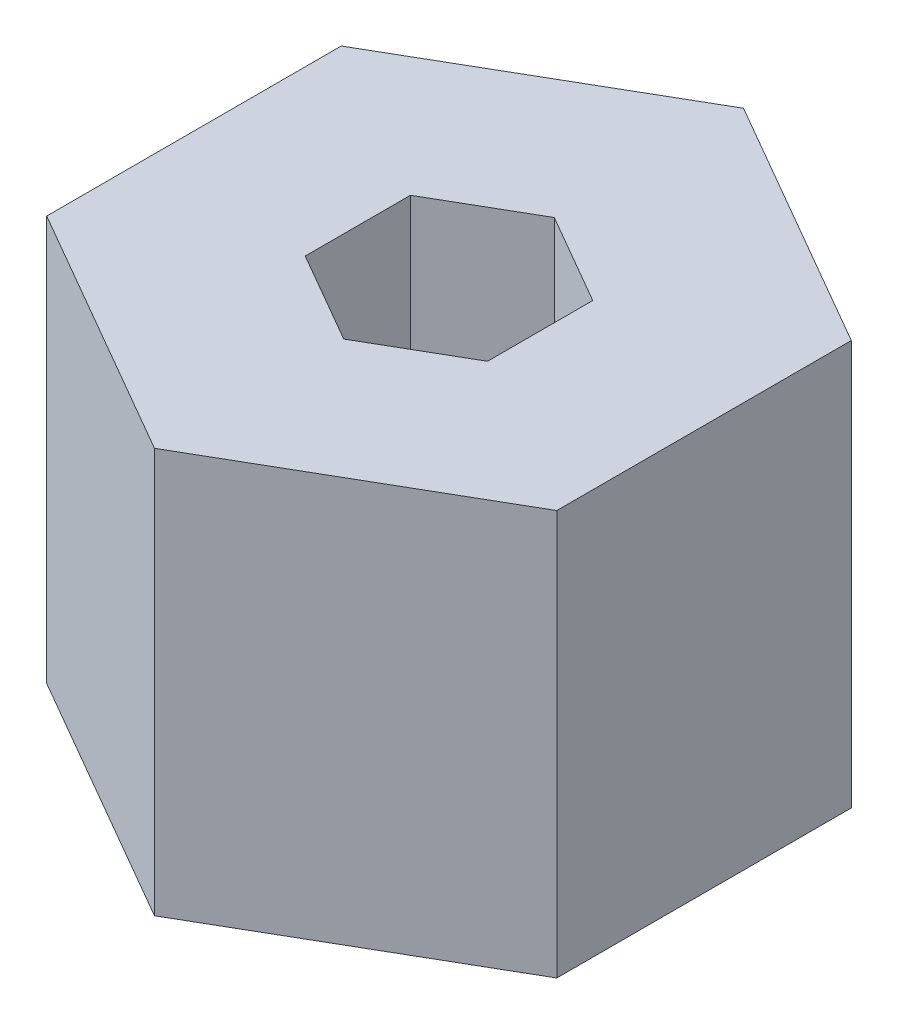
ISO-10303-21;
HEADER;
FILE_DESCRIPTION(('STEP AP214'),'2;1');
FILE_NAME('part.step','',(''),(''),'','','');
FILE_SCHEMA(('AUTOMOTIVE_DESIGN { 1 0 10303 214 1 1 1 1 }'));
ENDSEC;
DATA;
#1=APPLICATION_CONTEXT('core data for automotive mechanical design processes');
#2=APPLICATION_PROTOCOL_DEFINITION('international standard','automotive_design',2000,#1);
#3=PRODUCT_CONTEXT('',#1,'mechanical');
#4=PRODUCT('Part','Part','',(#3));
#5=PRODUCT_RELATED_PRODUCT_CATEGORY('part','',(#4));
#6=PRODUCT_DEFINITION_FORMATION('','',#4);
#7=PRODUCT_DEFINITION_CONTEXT('part definition',#1,'design');
#8=PRODUCT_DEFINITION('design','',#6,#7);
#9=PRODUCT_DEFINITION_SHAPE('','',#8);
#10=(LENGTH_UNIT() NAMED_UNIT(*) SI_UNIT(.MILLI.,.METRE.));
#11=(NAMED_UNIT(*) PLANE_ANGLE_UNIT() SI_UNIT($,.RADIAN.));
#12=(NAMED_UNIT(*) SI_UNIT($,.STERADIAN.) SOLID_ANGLE_UNIT());
#13=UNCERTAINTY_MEASURE_WITH_UNIT(LENGTH_MEASURE(1.E-05),#10,'distance_accuracy_value','');
#14=(GEOMETRIC_REPRESENTATION_CONTEXT(3) GLOBAL_UNCERTAINTY_ASSIGNED_CONTEXT((#13)) GLOBAL_UNIT_ASSIGNED_CONTEXT((#10,
#11,#12)) REPRESENTATION_CONTEXT('',''));
#15=CARTESIAN_POINT('',(0.,0.,0.));
#16=DIRECTION('',(0.,0.,1.));
#17=DIRECTION('',(1.,0.,0.));
#18=AXIS2_PLACEMENT_3D('',#15,#16,#17);
#19=CARTESIAN_POINT('',(0.,10.,0.));
#20=DIRECTION('',(0.,1.,0.));
#21=DIRECTION('',(0.,0.,1.));
#22=AXIS2_PLACEMENT_3D('',#19,#20,#21);
#23=PLANE('',#22);
#24=DIRECTION('',(-0.866025403784439,0.,-0.5));
#25=VECTOR('',#24,1.);
#26=CARTESIAN_POINT('',(6.3,10.,-3.63730669589464));
#27=LINE('',#26,#25);
#28=CARTESIAN_POINT('',(6.3,10.,-3.63730669589464));
#29=VERTEX_POINT('',#28);
#30=CARTESIAN_POINT('',(0.,10.,-7.27461339178929));
#31=VERTEX_POINT('',#30);
#32=EDGE_CURVE('E173',#29,#31,#27,.T.);
#33=ORIENTED_EDGE('',*,*,#32,.T.);
#34=DIRECTION('',(-0.866025403784438,0.,0.5));
#35=VECTOR('',#34,1.);
#36=CARTESIAN_POINT('',(0.,10.,-7.27461339178929));
#37=LINE('',#36,#35);
#38=CARTESIAN_POINT('',(-6.3,10.,-3.63730669589464));
#39=VERTEX_POINT('',#38);
#40=EDGE_CURVE('E176',#31,#39,#37,.T.);
#41=ORIENTED_EDGE('',*,*,#40,.T.);
#42=DIRECTION('',(0.,0.,1.));
#43=VECTOR('',#42,1.);
#44=CARTESIAN_POINT('',(-6.3,10.,-3.63730669589464));
#45=LINE('',#44,#43);
#46=CARTESIAN_POINT('',(-6.3,10.,3.63730669589464));
#47=VERTEX_POINT('',#46);
#48=EDGE_CURVE('E179',#39,#47,#45,.T.);
#49=ORIENTED_EDGE('',*,*,#48,.T.);
#50=DIRECTION('',(0.866025403784439,0.,0.5));
#51=VECTOR('',#50,1.);
#52=CARTESIAN_POINT('',(-6.3,10.,3.63730669589464));
#53=LINE('',#52,#51);
#54=CARTESIAN_POINT('',(0.,10.,7.27461339178929));
#55=VERTEX_POINT('',#54);
#56=EDGE_CURVE('E181',#47,#55,#53,.T.);
#57=ORIENTED_EDGE('',*,*,#56,.T.);
#58=DIRECTION('',(0.866025403784439,0.,-0.5));
#59=VECTOR('',#58,1.);
#60=CARTESIAN_POINT('',(0.,10.,7.27461339178929));
#61=LINE('',#60,#59);
#62=CARTESIAN_POINT('',(6.3,10.,3.63730669589464));
#63=VERTEX_POINT('',#62);
#64=EDGE_CURVE('E183',#55,#63,#61,.T.);
#65=ORIENTED_EDGE('',*,*,#64,.T.);
#66=DIRECTION('',(0.,0.,-1.));
#67=VECTOR('',#66,1.);
#68=CARTESIAN_POINT('',(6.3,10.,3.63730669589464));
#69=LINE('',#68,#67);
#70=EDGE_CURVE('E185',#63,#29,#69,.T.);
#71=ORIENTED_EDGE('',*,*,#70,.T.);
#72=EDGE_LOOP('',(#33,#41,#49,#57,#65,#71));
#73=FACE_BOUND('',#72,.T.);
#74=DIRECTION('',(-0.866025403784439,0.,0.5));
#75=VECTOR('',#74,1.);
#76=CARTESIAN_POINT('',(0.,10.,-2.6));
#77=LINE('',#76,#75);
#78=CARTESIAN_POINT('',(0.,10.,-2.6));
#79=VERTEX_POINT('',#78);
#80=CARTESIAN_POINT('',(-2.25166604983954,10.,-1.3));
#81=VERTEX_POINT('',#80);
#82=EDGE_CURVE('E130',#79,#81,#77,.T.);
#83=ORIENTED_EDGE('',*,*,#82,.F.);
#84=DIRECTION('',(-0.866025403784439,0.,-0.5));
#85=VECTOR('',#84,1.);
#86=CARTESIAN_POINT('',(2.25166604983954,10.,-1.3));
#87=LINE('',#86,#85);
#88=CARTESIAN_POINT('',(2.25166604983954,10.,-1.3));
#89=VERTEX_POINT('',#88);
#90=EDGE_CURVE('E122',#89,#79,#87,.T.);
#91=ORIENTED_EDGE('',*,*,#90,.F.);
#92=DIRECTION('',(0.,0.,-1.));
#93=VECTOR('',#92,1.);
#94=CARTESIAN_POINT('',(2.25166604983954,10.,1.3));
#95=LINE('',#94,#93);
#96=CARTESIAN_POINT('',(2.25166604983954,10.,1.3));
#97=VERTEX_POINT('',#96);
#98=EDGE_CURVE('E151',#97,#89,#95,.T.);
#99=ORIENTED_EDGE('',*,*,#98,.F.);
#100=DIRECTION('',(0.866025403784439,0.,-0.5));
#101=VECTOR('',#100,1.);
#102=CARTESIAN_POINT('',(0.,10.,2.6));
#103=LINE('',#102,#101);
#104=CARTESIAN_POINT('',(0.,10.,2.6));
#105=VERTEX_POINT('',#104);
#106=EDGE_CURVE('E149',#105,#97,#103,.T.);
#107=ORIENTED_EDGE('',*,*,#106,.F.);
#108=DIRECTION('',(0.866025403784439,0.,0.5));
#109=VECTOR('',#108,1.);
#110=CARTESIAN_POINT('',(-2.25166604983954,10.,1.3));
#111=LINE('',#110,#109);
#112=CARTESIAN_POINT('',(-2.25166604983954,10.,1.3));
#113=VERTEX_POINT('',#112);
#114=EDGE_CURVE('E145',#113,#105,#111,.T.);
#115=ORIENTED_EDGE('',*,*,#114,.F.);
#116=DIRECTION('',(0.,0.,1.));
#117=VECTOR('',#116,1.);
#118=CARTESIAN_POINT('',(-2.25166604983954,10.,-1.3));
#119=LINE('',#118,#117);
#120=EDGE_CURVE('E143',#81,#113,#119,.T.);
#121=ORIENTED_EDGE('',*,*,#120,.F.);
#122=EDGE_LOOP('',(#83,#91,#99,#107,#115,#121));
#123=FACE_BOUND('',#122,.T.);
#124=ADVANCED_FACE('F33',(#73,#123),#23,.T.);
#125=CARTESIAN_POINT('',(0.,0.,0.));
#126=DIRECTION('',(0.,1.,0.));
#127=DIRECTION('',(0.,0.,1.));
#128=AXIS2_PLACEMENT_3D('',#125,#126,#127);
#129=PLANE('',#128);
#130=DIRECTION('',(-0.866025403784439,0.,-0.5));
#131=VECTOR('',#130,1.);
#132=CARTESIAN_POINT('',(6.3,0.,-3.63730669589464));
#133=LINE('',#132,#131);
#134=CARTESIAN_POINT('',(6.3,0.,-3.63730669589464));
#135=VERTEX_POINT('',#134);
#136=CARTESIAN_POINT('',(0.,0.,-7.27461339178929));
#137=VERTEX_POINT('',#136);
#138=EDGE_CURVE('E138',#135,#137,#133,.T.);
#139=ORIENTED_EDGE('',*,*,#138,.F.);
#140=DIRECTION('',(0.,0.,-1.));
#141=VECTOR('',#140,1.);
#142=CARTESIAN_POINT('',(6.3,0.,3.63730669589464));
#143=LINE('',#142,#141);
#144=CARTESIAN_POINT('',(6.3,0.,3.63730669589464));
#145=VERTEX_POINT('',#144);
#146=EDGE_CURVE('E177',#145,#135,#143,.T.);
#147=ORIENTED_EDGE('',*,*,#146,.F.);
#148=DIRECTION('',(0.866025403784439,0.,-0.5));
#149=VECTOR('',#148,1.);
#150=CARTESIAN_POINT('',(0.,0.,7.27461339178929));
#151=LINE('',#150,#149);
#152=CARTESIAN_POINT('',(0.,0.,7.27461339178929));
#153=VERTEX_POINT('',#152);
#154=EDGE_CURVE('E196',#153,#145,#151,.T.);
#155=ORIENTED_EDGE('',*,*,#154,.F.);
#156=DIRECTION('',(0.866025403784439,0.,0.5));
#157=VECTOR('',#156,1.);
#158=CARTESIAN_POINT('',(-6.3,0.,3.63730669589464));
#159=LINE('',#158,#157);
#160=CARTESIAN_POINT('',(-6.3,0.,3.63730669589464));
#161=VERTEX_POINT('',#160);
#162=EDGE_CURVE('E194',#161,#153,#159,.T.);
#163=ORIENTED_EDGE('',*,*,#162,.F.);
#164=DIRECTION('',(0.,0.,1.));
#165=VECTOR('',#164,1.);
#166=CARTESIAN_POINT('',(-6.3,0.,-3.63730669589464));
#167=LINE('',#166,#165);
#168=CARTESIAN_POINT('',(-6.3,0.,-3.63730669589464));
#169=VERTEX_POINT('',#168);
#170=EDGE_CURVE('E192',#169,#161,#167,.T.);
#171=ORIENTED_EDGE('',*,*,#170,.F.);
#172=DIRECTION('',(-0.866025403784438,0.,0.5));
#173=VECTOR('',#172,1.);
#174=CARTESIAN_POINT('',(0.,0.,-7.27461339178929));
#175=LINE('',#174,#173);
#176=EDGE_CURVE('E190',#137,#169,#175,.T.);
#177=ORIENTED_EDGE('',*,*,#176,.F.);
#178=EDGE_LOOP('',(#139,#147,#155,#163,#171,#177));
#179=FACE_BOUND('',#178,.T.);
#180=DIRECTION('',(-0.866025403784439,0.,-0.5));
#181=VECTOR('',#180,1.);
#182=CARTESIAN_POINT('',(2.25166604983954,0.,-1.3));
#183=LINE('',#182,#181);
#184=CARTESIAN_POINT('',(2.25166604983954,0.,-1.3));
#185=VERTEX_POINT('',#184);
#186=CARTESIAN_POINT('',(0.,0.,-2.6));
#187=VERTEX_POINT('',#186);
#188=EDGE_CURVE('E56',#185,#187,#183,.T.);
#189=ORIENTED_EDGE('',*,*,#188,.T.);
#190=DIRECTION('',(-0.866025403784439,0.,0.5));
#191=VECTOR('',#190,1.);
#192=CARTESIAN_POINT('',(0.,0.,-2.6));
#193=LINE('',#192,#191);
#194=CARTESIAN_POINT('',(-2.25166604983954,0.,-1.3));
#195=VERTEX_POINT('',#194);
#196=EDGE_CURVE('E137',#187,#195,#193,.T.);
#197=ORIENTED_EDGE('',*,*,#196,.T.);
#198=DIRECTION('',(0.,0.,1.));
#199=VECTOR('',#198,1.);
#200=CARTESIAN_POINT('',(-2.25166604983954,0.,-1.3));
#201=LINE('',#200,#199);
#202=CARTESIAN_POINT('',(-2.25166604983954,0.,1.3));
#203=VERTEX_POINT('',#202);
#204=EDGE_CURVE('E155',#195,#203,#201,.T.);
#205=ORIENTED_EDGE('',*,*,#204,.T.);
#206=DIRECTION('',(0.866025403784439,0.,0.5));
#207=VECTOR('',#206,1.);
#208=CARTESIAN_POINT('',(-2.25166604983954,0.,1.3));
#209=LINE('',#208,#207);
#210=CARTESIAN_POINT('',(0.,0.,2.6));
#211=VERTEX_POINT('',#210);
#212=EDGE_CURVE('E158',#203,#211,#209,.T.);
#213=ORIENTED_EDGE('',*,*,#212,.T.);
#214=DIRECTION('',(0.866025403784439,0.,-0.5));
#215=VECTOR('',#214,1.);
#216=CARTESIAN_POINT('',(0.,0.,2.6));
#217=LINE('',#216,#215);
#218=CARTESIAN_POINT('',(2.25166604983954,0.,1.3));
#219=VERTEX_POINT('',#218);
#220=EDGE_CURVE('E161',#211,#219,#217,.T.);
#221=ORIENTED_EDGE('',*,*,#220,.T.);
#222=DIRECTION('',(0.,0.,-1.));
#223=VECTOR('',#222,1.);
#224=CARTESIAN_POINT('',(2.25166604983954,0.,1.3));
#225=LINE('',#224,#223);
#226=EDGE_CURVE('E131',#219,#185,#225,.T.);
#227=ORIENTED_EDGE('',*,*,#226,.T.);
#228=EDGE_LOOP('',(#189,#197,#205,#213,#221,#227));
#229=FACE_BOUND('',#228,.T.);
#230=ADVANCED_FACE('F220',(#179,#229),#129,.F.);
#231=CARTESIAN_POINT('',(6.3,10.,-3.63730669589464));
#232=DIRECTION('',(-0.5,0.,0.866025403784439));
#233=DIRECTION('',(0.866025403784439,0.,0.5));
#234=AXIS2_PLACEMENT_3D('',#231,#232,#233);
#235=PLANE('',#234);
#236=ORIENTED_EDGE('',*,*,#138,.T.);
#237=DIRECTION('',(0.,-1.,0.));
#238=VECTOR('',#237,1.);
#239=CARTESIAN_POINT('',(0.,10.,-7.27461339178929));
#240=LINE('',#239,#238);
#241=EDGE_CURVE('E11',#31,#137,#240,.T.);
#242=ORIENTED_EDGE('',*,*,#241,.F.);
#243=ORIENTED_EDGE('',*,*,#32,.F.);
#244=DIRECTION('',(0.,-1.,0.));
#245=VECTOR('',#244,1.);
#246=CARTESIAN_POINT('',(6.3,10.,-3.63730669589464));
#247=LINE('',#246,#245);
#248=EDGE_CURVE('E187',#29,#135,#247,.T.);
#249=ORIENTED_EDGE('',*,*,#248,.T.);
#250=EDGE_LOOP('',(#236,#242,#243,#249));
#251=FACE_BOUND('',#250,.T.);
#252=ADVANCED_FACE('F35',(#251),#235,.F.);
#253=CARTESIAN_POINT('',(0.,10.,-7.27461339178929));
#254=DIRECTION('',(0.5,0.,0.866025403784438));
#255=DIRECTION('',(0.866025403784438,0.,-0.5));
#256=AXIS2_PLACEMENT_3D('',#253,#254,#255);
#257=PLANE('',#256);
#258=ORIENTED_EDGE('',*,*,#176,.T.);
#259=DIRECTION('',(0.,-1.,0.));
#260=VECTOR('',#259,1.);
#261=CARTESIAN_POINT('',(-6.3,10.,-3.63730669589464));
#262=LINE('',#261,#260);
#263=EDGE_CURVE('E41',#39,#169,#262,.T.);
#264=ORIENTED_EDGE('',*,*,#263,.F.);
#265=ORIENTED_EDGE('',*,*,#40,.F.);
#266=ORIENTED_EDGE('',*,*,#241,.T.);
#267=EDGE_LOOP('',(#258,#264,#265,#266));
#268=FACE_BOUND('',#267,.T.);
#269=ADVANCED_FACE('F237',(#268),#257,.F.);
#270=CARTESIAN_POINT('',(-6.3,10.,-3.63730669589464));
#271=DIRECTION('',(1.,0.,0.));
#272=DIRECTION('',(0.,0.,-1.));
#273=AXIS2_PLACEMENT_3D('',#270,#271,#272);
#274=PLANE('',#273);
#275=ORIENTED_EDGE('',*,*,#170,.T.);
#276=DIRECTION('',(0.,-1.,0.));
#277=VECTOR('',#276,1.);
#278=CARTESIAN_POINT('',(-6.3,10.,3.63730669589464));
#279=LINE('',#278,#277);
#280=EDGE_CURVE('E207',#47,#161,#279,.T.);
#281=ORIENTED_EDGE('',*,*,#280,.F.);
#282=ORIENTED_EDGE('',*,*,#48,.F.);
#283=ORIENTED_EDGE('',*,*,#263,.T.);
#284=EDGE_LOOP('',(#275,#281,#282,#283));
#285=FACE_BOUND('',#284,.T.);
#286=ADVANCED_FACE('F214',(#285),#274,.F.);
#287=CARTESIAN_POINT('',(-6.3,10.,3.63730669589464));
#288=DIRECTION('',(0.5,0.,-0.866025403784439));
#289=DIRECTION('',(-0.866025403784439,0.,-0.5));
#290=AXIS2_PLACEMENT_3D('',#287,#288,#289);
#291=PLANE('',#290);
#292=ORIENTED_EDGE('',*,*,#162,.T.);
#293=DIRECTION('',(0.,-1.,0.));
#294=VECTOR('',#293,1.);
#295=CARTESIAN_POINT('',(0.,10.,7.27461339178929));
#296=LINE('',#295,#294);
#297=EDGE_CURVE('E204',#55,#153,#296,.T.);
#298=ORIENTED_EDGE('',*,*,#297,.F.);
#299=ORIENTED_EDGE('',*,*,#56,.F.);
#300=ORIENTED_EDGE('',*,*,#280,.T.);
#301=EDGE_LOOP('',(#292,#298,#299,#300));
#302=FACE_BOUND('',#301,.T.);
#303=ADVANCED_FACE('F226',(#302),#291,.F.);
#304=CARTESIAN_POINT('',(0.,10.,7.27461339178929));
#305=DIRECTION('',(-0.5,0.,-0.866025403784439));
#306=DIRECTION('',(-0.866025403784439,0.,0.5));
#307=AXIS2_PLACEMENT_3D('',#304,#305,#306);
#308=PLANE('',#307);
#309=ORIENTED_EDGE('',*,*,#154,.T.);
#310=DIRECTION('',(0.,-1.,0.));
#311=VECTOR('',#310,1.);
#312=CARTESIAN_POINT('',(6.3,10.,3.63730669589464));
#313=LINE('',#312,#311);
#314=EDGE_CURVE('E201',#63,#145,#313,.T.);
#315=ORIENTED_EDGE('',*,*,#314,.F.);
#316=ORIENTED_EDGE('',*,*,#64,.F.);
#317=ORIENTED_EDGE('',*,*,#297,.T.);
#318=EDGE_LOOP('',(#309,#315,#316,#317));
#319=FACE_BOUND('',#318,.T.);
#320=ADVANCED_FACE('F230',(#319),#308,.F.);
#321=CARTESIAN_POINT('',(6.3,10.,3.63730669589464));
#322=DIRECTION('',(-1.,0.,0.));
#323=DIRECTION('',(0.,0.,1.));
#324=AXIS2_PLACEMENT_3D('',#321,#322,#323);
#325=PLANE('',#324);
#326=ORIENTED_EDGE('',*,*,#146,.T.);
#327=ORIENTED_EDGE('',*,*,#248,.F.);
#328=ORIENTED_EDGE('',*,*,#70,.F.);
#329=ORIENTED_EDGE('',*,*,#314,.T.);
#330=EDGE_LOOP('',(#326,#327,#328,#329));
#331=FACE_BOUND('',#330,.T.);
#332=ADVANCED_FACE('F240',(#331),#325,.F.);
#333=CARTESIAN_POINT('',(2.25166604983954,10.,-1.3));
#334=DIRECTION('',(-0.5,0.,0.866025403784439));
#335=DIRECTION('',(0.866025403784439,0.,0.5));
#336=AXIS2_PLACEMENT_3D('',#333,#334,#335);
#337=PLANE('',#336);
#338=ORIENTED_EDGE('',*,*,#188,.F.);
#339=DIRECTION('',(0.,-1.,0.));
#340=VECTOR('',#339,1.);
#341=CARTESIAN_POINT('',(2.25166604983954,10.,-1.3));
#342=LINE('',#341,#340);
#343=EDGE_CURVE('E126',#89,#185,#342,.T.);
#344=ORIENTED_EDGE('',*,*,#343,.F.);
#345=ORIENTED_EDGE('',*,*,#90,.T.);
#346=DIRECTION('',(0.,-1.,0.));
#347=VECTOR('',#346,1.);
#348=CARTESIAN_POINT('',(0.,10.,-2.6));
#349=LINE('',#348,#347);
#350=EDGE_CURVE('E125',#79,#187,#349,.T.);
#351=ORIENTED_EDGE('',*,*,#350,.T.);
#352=EDGE_LOOP('',(#338,#344,#345,#351));
#353=FACE_BOUND('',#352,.T.);
#354=ADVANCED_FACE('F124',(#353),#337,.T.);
#355=CARTESIAN_POINT('',(0.,10.,-2.6));
#356=DIRECTION('',(0.5,0.,0.866025403784439));
#357=DIRECTION('',(0.866025403784439,0.,-0.5));
#358=AXIS2_PLACEMENT_3D('',#355,#356,#357);
#359=PLANE('',#358);
#360=ORIENTED_EDGE('',*,*,#196,.F.);
#361=ORIENTED_EDGE('',*,*,#350,.F.);
#362=ORIENTED_EDGE('',*,*,#82,.T.);
#363=DIRECTION('',(0.,-1.,0.));
#364=VECTOR('',#363,1.);
#365=CARTESIAN_POINT('',(-2.25166604983954,10.,-1.3));
#366=LINE('',#365,#364);
#367=EDGE_CURVE('E139',#81,#195,#366,.T.);
#368=ORIENTED_EDGE('',*,*,#367,.T.);
#369=EDGE_LOOP('',(#360,#361,#362,#368));
#370=FACE_BOUND('',#369,.T.);
#371=ADVANCED_FACE('F134',(#370),#359,.T.);
#372=CARTESIAN_POINT('',(-2.25166604983954,10.,-1.3));
#373=DIRECTION('',(1.,0.,0.));
#374=DIRECTION('',(0.,0.,-1.));
#375=AXIS2_PLACEMENT_3D('',#372,#373,#374);
#376=PLANE('',#375);
#377=ORIENTED_EDGE('',*,*,#204,.F.);
#378=ORIENTED_EDGE('',*,*,#367,.F.);
#379=ORIENTED_EDGE('',*,*,#120,.T.);
#380=DIRECTION('',(0.,-1.,0.));
#381=VECTOR('',#380,1.);
#382=CARTESIAN_POINT('',(-2.25166604983954,10.,1.3));
#383=LINE('',#382,#381);
#384=EDGE_CURVE('E170',#113,#203,#383,.T.);
#385=ORIENTED_EDGE('',*,*,#384,.T.);
#386=EDGE_LOOP('',(#377,#378,#379,#385));
#387=FACE_BOUND('',#386,.T.);
#388=ADVANCED_FACE('F258',(#387),#376,.T.);
#389=CARTESIAN_POINT('',(-2.25166604983954,10.,1.3));
#390=DIRECTION('',(0.5,0.,-0.866025403784439));
#391=DIRECTION('',(-0.866025403784439,0.,-0.5));
#392=AXIS2_PLACEMENT_3D('',#389,#390,#391);
#393=PLANE('',#392);
#394=ORIENTED_EDGE('',*,*,#212,.F.);
#395=ORIENTED_EDGE('',*,*,#384,.F.);
#396=ORIENTED_EDGE('',*,*,#114,.T.);
#397=DIRECTION('',(0.,-1.,0.));
#398=VECTOR('',#397,1.);
#399=CARTESIAN_POINT('',(0.,10.,2.6));
#400=LINE('',#399,#398);
#401=EDGE_CURVE('E168',#105,#211,#400,.T.);
#402=ORIENTED_EDGE('',*,*,#401,.T.);
#403=EDGE_LOOP('',(#394,#395,#396,#402));
#404=FACE_BOUND('',#403,.T.);
#405=ADVANCED_FACE('F261',(#404),#393,.T.);
#406=CARTESIAN_POINT('',(0.,10.,2.6));
#407=DIRECTION('',(-0.5,0.,-0.866025403784439));
#408=DIRECTION('',(-0.866025403784439,0.,0.5));
#409=AXIS2_PLACEMENT_3D('',#406,#407,#408);
#410=PLANE('',#409);
#411=ORIENTED_EDGE('',*,*,#220,.F.);
#412=ORIENTED_EDGE('',*,*,#401,.F.);
#413=ORIENTED_EDGE('',*,*,#106,.T.);
#414=DIRECTION('',(0.,-1.,0.));
#415=VECTOR('',#414,1.);
#416=CARTESIAN_POINT('',(2.25166604983954,10.,1.3));
#417=LINE('',#416,#415);
#418=EDGE_CURVE('E48',#97,#219,#417,.T.);
#419=ORIENTED_EDGE('',*,*,#418,.T.);
#420=EDGE_LOOP('',(#411,#412,#413,#419));
#421=FACE_BOUND('',#420,.T.);
#422=ADVANCED_FACE('F265',(#421),#410,.T.);
#423=CARTESIAN_POINT('',(2.25166604983954,10.,1.3));
#424=DIRECTION('',(-1.,0.,0.));
#425=DIRECTION('',(0.,0.,1.));
#426=AXIS2_PLACEMENT_3D('',#423,#424,#425);
#427=PLANE('',#426);
#428=ORIENTED_EDGE('',*,*,#226,.F.);
#429=ORIENTED_EDGE('',*,*,#418,.F.);
#430=ORIENTED_EDGE('',*,*,#98,.T.);
#431=ORIENTED_EDGE('',*,*,#343,.T.);
#432=EDGE_LOOP('',(#428,#429,#430,#431));
#433=FACE_BOUND('',#432,.T.);
#434=ADVANCED_FACE('F269',(#433),#427,.T.);
#435=CLOSED_SHELL('',(#124,#230,#252,#269,#286,#303,#320,#332,#354,#371,#388,#405,#422,#434));
#436=MANIFOLD_SOLID_BREP('B2',#435);
#437=ADVANCED_BREP_SHAPE_REPRESENTATION('',(#18,#436),#14);
#438=SHAPE_DEFINITION_REPRESENTATION(#9,#437);
ENDSEC;
END-ISO-10303-21;
